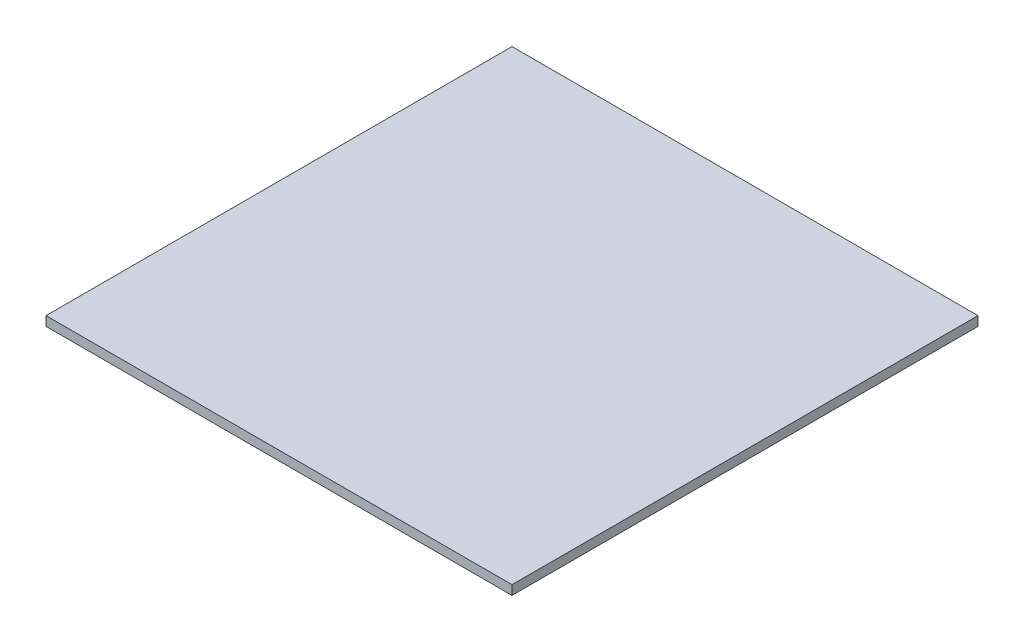
ISO-10303-21;
HEADER;
FILE_DESCRIPTION(('STEP AP214'),'2;1');
FILE_NAME('part.step','',(''),(''),'','','');
FILE_SCHEMA(('AUTOMOTIVE_DESIGN { 1 0 10303 214 1 1 1 1 }'));
ENDSEC;
DATA;
#1=APPLICATION_CONTEXT('core data for automotive mechanical design processes');
#2=APPLICATION_PROTOCOL_DEFINITION('international standard','automotive_design',2000,#1);
#3=PRODUCT_CONTEXT('',#1,'mechanical');
#4=PRODUCT('Part','Part','',(#3));
#5=PRODUCT_RELATED_PRODUCT_CATEGORY('part','',(#4));
#6=PRODUCT_DEFINITION_FORMATION('','',#4);
#7=PRODUCT_DEFINITION_CONTEXT('part definition',#1,'design');
#8=PRODUCT_DEFINITION('design','',#6,#7);
#9=PRODUCT_DEFINITION_SHAPE('','',#8);
#10=(LENGTH_UNIT() NAMED_UNIT(*) SI_UNIT(.MILLI.,.METRE.));
#11=(NAMED_UNIT(*) PLANE_ANGLE_UNIT() SI_UNIT($,.RADIAN.));
#12=(NAMED_UNIT(*) SI_UNIT($,.STERADIAN.) SOLID_ANGLE_UNIT());
#13=UNCERTAINTY_MEASURE_WITH_UNIT(LENGTH_MEASURE(1.E-05),#10,'distance_accuracy_value','');
#14=(GEOMETRIC_REPRESENTATION_CONTEXT(3) GLOBAL_UNCERTAINTY_ASSIGNED_CONTEXT((#13)) GLOBAL_UNIT_ASSIGNED_CONTEXT((#10,
#11,#12)) REPRESENTATION_CONTEXT('',''));
#15=CARTESIAN_POINT('',(0.,0.,0.));
#16=DIRECTION('',(0.,0.,1.));
#17=DIRECTION('',(1.,0.,0.));
#18=AXIS2_PLACEMENT_3D('',#15,#16,#17);
#19=CARTESIAN_POINT('',(0.,10.,0.));
#20=DIRECTION('',(1.,0.,0.));
#21=DIRECTION('',(0.,0.,-1.));
#22=AXIS2_PLACEMENT_3D('',#19,#20,#21);
#23=PLANE('',#22);
#24=DIRECTION('',(0.,0.,1.));
#25=VECTOR('',#24,1.);
#26=CARTESIAN_POINT('',(0.,0.,0.));
#27=LINE('',#26,#25);
#28=CARTESIAN_POINT('',(0.,0.,-500.));
#29=VERTEX_POINT('',#28);
#30=CARTESIAN_POINT('',(0.,0.,0.));
#31=VERTEX_POINT('',#30);
#32=EDGE_CURVE('E95',#29,#31,#27,.T.);
#33=ORIENTED_EDGE('',*,*,#32,.T.);
#34=DIRECTION('',(0.,-1.,0.));
#35=VECTOR('',#34,1.);
#36=CARTESIAN_POINT('',(0.,10.,0.));
#37=LINE('',#36,#35);
#38=CARTESIAN_POINT('',(0.,10.,0.));
#39=VERTEX_POINT('',#38);
#40=EDGE_CURVE('E11',#39,#31,#37,.T.);
#41=ORIENTED_EDGE('',*,*,#40,.F.);
#42=DIRECTION('',(0.,0.,1.));
#43=VECTOR('',#42,1.);
#44=CARTESIAN_POINT('',(0.,10.,0.));
#45=LINE('',#44,#43);
#46=CARTESIAN_POINT('',(0.,10.,-500.));
#47=VERTEX_POINT('',#46);
#48=EDGE_CURVE('E83',#47,#39,#45,.T.);
#49=ORIENTED_EDGE('',*,*,#48,.F.);
#50=DIRECTION('',(0.,-1.,0.));
#51=VECTOR('',#50,1.);
#52=CARTESIAN_POINT('',(0.,10.,-500.));
#53=LINE('',#52,#51);
#54=EDGE_CURVE('E91',#47,#29,#53,.T.);
#55=ORIENTED_EDGE('',*,*,#54,.T.);
#56=EDGE_LOOP('',(#33,#41,#49,#55));
#57=FACE_BOUND('',#56,.T.);
#58=ADVANCED_FACE('F32',(#57),#23,.F.);
#59=CARTESIAN_POINT('',(0.,10.,0.));
#60=DIRECTION('',(0.,0.,-1.));
#61=DIRECTION('',(-1.,0.,0.));
#62=AXIS2_PLACEMENT_3D('',#59,#60,#61);
#63=PLANE('',#62);
#64=DIRECTION('',(1.,0.,0.));
#65=VECTOR('',#64,1.);
#66=CARTESIAN_POINT('',(0.,0.,0.));
#67=LINE('',#66,#65);
#68=CARTESIAN_POINT('',(500.,0.,0.));
#69=VERTEX_POINT('',#68);
#70=EDGE_CURVE('E87',#31,#69,#67,.T.);
#71=ORIENTED_EDGE('',*,*,#70,.T.);
#72=DIRECTION('',(0.,-1.,0.));
#73=VECTOR('',#72,1.);
#74=CARTESIAN_POINT('',(500.,10.,0.));
#75=LINE('',#74,#73);
#76=CARTESIAN_POINT('',(500.,10.,0.));
#77=VERTEX_POINT('',#76);
#78=EDGE_CURVE('E40',#77,#69,#75,.T.);
#79=ORIENTED_EDGE('',*,*,#78,.F.);
#80=DIRECTION('',(1.,0.,0.));
#81=VECTOR('',#80,1.);
#82=CARTESIAN_POINT('',(0.,10.,0.));
#83=LINE('',#82,#81);
#84=EDGE_CURVE('E78',#39,#77,#83,.T.);
#85=ORIENTED_EDGE('',*,*,#84,.F.);
#86=ORIENTED_EDGE('',*,*,#40,.T.);
#87=EDGE_LOOP('',(#71,#79,#85,#86));
#88=FACE_BOUND('',#87,.T.);
#89=ADVANCED_FACE('F86',(#88),#63,.F.);
#90=CARTESIAN_POINT('',(500.,10.,0.));
#91=DIRECTION('',(-1.,0.,0.));
#92=DIRECTION('',(0.,0.,1.));
#93=AXIS2_PLACEMENT_3D('',#90,#91,#92);
#94=PLANE('',#93);
#95=DIRECTION('',(0.,0.,-1.));
#96=VECTOR('',#95,1.);
#97=CARTESIAN_POINT('',(500.,0.,0.));
#98=LINE('',#97,#96);
#99=CARTESIAN_POINT('',(500.,0.,-500.));
#100=VERTEX_POINT('',#99);
#101=EDGE_CURVE('E65',#69,#100,#98,.T.);
#102=ORIENTED_EDGE('',*,*,#101,.T.);
#103=DIRECTION('',(0.,-1.,0.));
#104=VECTOR('',#103,1.);
#105=CARTESIAN_POINT('',(500.,10.,-500.));
#106=LINE('',#105,#104);
#107=CARTESIAN_POINT('',(500.,10.,-500.));
#108=VERTEX_POINT('',#107);
#109=EDGE_CURVE('E88',#108,#100,#106,.T.);
#110=ORIENTED_EDGE('',*,*,#109,.F.);
#111=DIRECTION('',(0.,0.,-1.));
#112=VECTOR('',#111,1.);
#113=CARTESIAN_POINT('',(500.,10.,0.));
#114=LINE('',#113,#112);
#115=EDGE_CURVE('E81',#77,#108,#114,.T.);
#116=ORIENTED_EDGE('',*,*,#115,.F.);
#117=ORIENTED_EDGE('',*,*,#78,.T.);
#118=EDGE_LOOP('',(#102,#110,#116,#117));
#119=FACE_BOUND('',#118,.T.);
#120=ADVANCED_FACE('F89',(#119),#94,.F.);
#121=CARTESIAN_POINT('',(0.,10.,-500.));
#122=DIRECTION('',(0.,0.,1.));
#123=DIRECTION('',(1.,0.,0.));
#124=AXIS2_PLACEMENT_3D('',#121,#122,#123);
#125=PLANE('',#124);
#126=DIRECTION('',(-1.,0.,0.));
#127=VECTOR('',#126,1.);
#128=CARTESIAN_POINT('',(0.,0.,-500.));
#129=LINE('',#128,#127);
#130=EDGE_CURVE('E71',#100,#29,#129,.T.);
#131=ORIENTED_EDGE('',*,*,#130,.T.);
#132=ORIENTED_EDGE('',*,*,#54,.F.);
#133=DIRECTION('',(-1.,0.,0.));
#134=VECTOR('',#133,1.);
#135=CARTESIAN_POINT('',(0.,10.,-500.));
#136=LINE('',#135,#134);
#137=EDGE_CURVE('E48',#108,#47,#136,.T.);
#138=ORIENTED_EDGE('',*,*,#137,.F.);
#139=ORIENTED_EDGE('',*,*,#109,.T.);
#140=EDGE_LOOP('',(#131,#132,#138,#139));
#141=FACE_BOUND('',#140,.T.);
#142=ADVANCED_FACE('F102',(#141),#125,.F.);
#143=CARTESIAN_POINT('',(0.,10.,0.));
#144=DIRECTION('',(0.,-1.,0.));
#145=DIRECTION('',(0.,0.,-1.));
#146=AXIS2_PLACEMENT_3D('',#143,#144,#145);
#147=PLANE('',#146);
#148=ORIENTED_EDGE('',*,*,#48,.T.);
#149=ORIENTED_EDGE('',*,*,#84,.T.);
#150=ORIENTED_EDGE('',*,*,#115,.T.);
#151=ORIENTED_EDGE('',*,*,#137,.T.);
#152=EDGE_LOOP('',(#148,#149,#150,#151));
#153=FACE_BOUND('',#152,.T.);
#154=ADVANCED_FACE('F79',(#153),#147,.F.);
#155=CARTESIAN_POINT('',(0.,0.,0.));
#156=DIRECTION('',(0.,-1.,0.));
#157=DIRECTION('',(0.,0.,-1.));
#158=AXIS2_PLACEMENT_3D('',#155,#156,#157);
#159=PLANE('',#158);
#160=ORIENTED_EDGE('',*,*,#32,.F.);
#161=ORIENTED_EDGE('',*,*,#130,.F.);
#162=ORIENTED_EDGE('',*,*,#101,.F.);
#163=ORIENTED_EDGE('',*,*,#70,.F.);
#164=EDGE_LOOP('',(#160,#161,#162,#163));
#165=FACE_BOUND('',#164,.T.);
#166=ADVANCED_FACE('F105',(#165),#159,.T.);
#167=CLOSED_SHELL('',(#58,#89,#120,#142,#154,#166));
#168=MANIFOLD_SOLID_BREP('B2',#167);
#169=ADVANCED_BREP_SHAPE_REPRESENTATION('',(#18,#168),#14);
#170=SHAPE_DEFINITION_REPRESENTATION(#9,#169);
ENDSEC;
END-ISO-10303-21;
